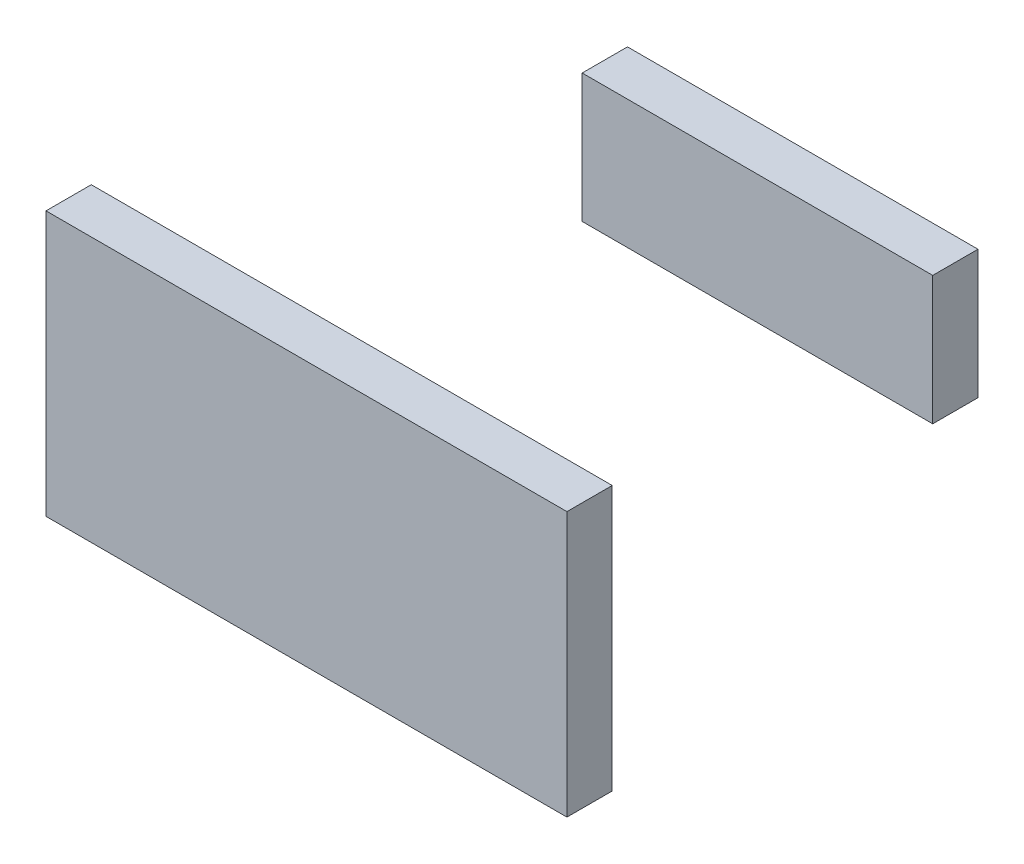
ISO-10303-21;
HEADER;
FILE_DESCRIPTION(('STEP AP214'),'2;1');
FILE_NAME('part.step','',(''),(''),'','','');
FILE_SCHEMA(('AUTOMOTIVE_DESIGN { 1 0 10303 214 1 1 1 1 }'));
ENDSEC;
DATA;
#1=APPLICATION_CONTEXT('core data for automotive mechanical design processes');
#2=APPLICATION_PROTOCOL_DEFINITION('international standard','automotive_design',2000,#1);
#3=PRODUCT_CONTEXT('',#1,'mechanical');
#4=PRODUCT('Part','Part','',(#3));
#5=PRODUCT_RELATED_PRODUCT_CATEGORY('part','',(#4));
#6=PRODUCT_DEFINITION_FORMATION('','',#4);
#7=PRODUCT_DEFINITION_CONTEXT('part definition',#1,'design');
#8=PRODUCT_DEFINITION('design','',#6,#7);
#9=PRODUCT_DEFINITION_SHAPE('','',#8);
#10=(LENGTH_UNIT() NAMED_UNIT(*) SI_UNIT(.MILLI.,.METRE.));
#11=(NAMED_UNIT(*) PLANE_ANGLE_UNIT() SI_UNIT($,.RADIAN.));
#12=(NAMED_UNIT(*) SI_UNIT($,.STERADIAN.) SOLID_ANGLE_UNIT());
#13=UNCERTAINTY_MEASURE_WITH_UNIT(LENGTH_MEASURE(1.E-05),#10,'distance_accuracy_value','');
#14=(GEOMETRIC_REPRESENTATION_CONTEXT(3) GLOBAL_UNCERTAINTY_ASSIGNED_CONTEXT((#13)) GLOBAL_UNIT_ASSIGNED_CONTEXT((#10,
#11,#12)) REPRESENTATION_CONTEXT('',''));
#15=CARTESIAN_POINT('',(0.,0.,0.));
#16=DIRECTION('',(0.,0.,1.));
#17=DIRECTION('',(1.,0.,0.));
#18=AXIS2_PLACEMENT_3D('',#15,#16,#17);
#19=CARTESIAN_POINT('',(-30.5127206325437,15.8128454974644,-40.));
#20=DIRECTION('',(1.,0.,0.));
#21=DIRECTION('',(0.,0.,-1.));
#22=AXIS2_PLACEMENT_3D('',#19,#20,#21);
#23=PLANE('',#22);
#24=DIRECTION('',(0.,-1.,0.));
#25=VECTOR('',#24,1.);
#26=CARTESIAN_POINT('',(-30.5127206325437,15.8128454974644,-50.));
#27=LINE('',#26,#25);
#28=CARTESIAN_POINT('',(-30.5127206325437,15.8128454974644,-50.));
#29=VERTEX_POINT('',#28);
#30=CARTESIAN_POINT('',(-30.5127206325437,-12.5885195711248,-50.));
#31=VERTEX_POINT('',#30);
#32=EDGE_CURVE('E112',#29,#31,#27,.T.);
#33=ORIENTED_EDGE('',*,*,#32,.T.);
#34=DIRECTION('',(0.,0.,-1.));
#35=VECTOR('',#34,1.);
#36=CARTESIAN_POINT('',(-30.5127206325437,-12.5885195711248,-40.));
#37=LINE('',#36,#35);
#38=CARTESIAN_POINT('',(-30.5127206325437,-12.5885195711248,-40.));
#39=VERTEX_POINT('',#38);
#40=EDGE_CURVE('E12',#39,#31,#37,.T.);
#41=ORIENTED_EDGE('',*,*,#40,.F.);
#42=DIRECTION('',(0.,-1.,0.));
#43=VECTOR('',#42,1.);
#44=CARTESIAN_POINT('',(-30.5127206325437,15.8128454974644,-40.));
#45=LINE('',#44,#43);
#46=CARTESIAN_POINT('',(-30.5127206325437,15.8128454974644,-40.));
#47=VERTEX_POINT('',#46);
#48=EDGE_CURVE('E100',#47,#39,#45,.T.);
#49=ORIENTED_EDGE('',*,*,#48,.F.);
#50=DIRECTION('',(0.,0.,-1.));
#51=VECTOR('',#50,1.);
#52=CARTESIAN_POINT('',(-30.5127206325437,15.8128454974644,-40.));
#53=LINE('',#52,#51);
#54=EDGE_CURVE('E108',#47,#29,#53,.T.);
#55=ORIENTED_EDGE('',*,*,#54,.T.);
#56=EDGE_LOOP('',(#33,#41,#49,#55));
#57=FACE_BOUND('',#56,.T.);
#58=ADVANCED_FACE('F49',(#57),#23,.F.);
#59=CARTESIAN_POINT('',(-30.5127206325437,-12.5885195711248,-40.));
#60=DIRECTION('',(0.,1.,0.));
#61=DIRECTION('',(0.,0.,1.));
#62=AXIS2_PLACEMENT_3D('',#59,#60,#61);
#63=PLANE('',#62);
#64=DIRECTION('',(1.,0.,0.));
#65=VECTOR('',#64,1.);
#66=CARTESIAN_POINT('',(-30.5127206325437,-12.5885195711248,-50.));
#67=LINE('',#66,#65);
#68=CARTESIAN_POINT('',(46.9096886760667,-12.5885195711248,-50.));
#69=VERTEX_POINT('',#68);
#70=EDGE_CURVE('E104',#31,#69,#67,.T.);
#71=ORIENTED_EDGE('',*,*,#70,.T.);
#72=DIRECTION('',(0.,0.,-1.));
#73=VECTOR('',#72,1.);
#74=CARTESIAN_POINT('',(46.9096886760667,-12.5885195711248,-40.));
#75=LINE('',#74,#73);
#76=CARTESIAN_POINT('',(46.9096886760667,-12.5885195711248,-40.));
#77=VERTEX_POINT('',#76);
#78=EDGE_CURVE('E57',#77,#69,#75,.T.);
#79=ORIENTED_EDGE('',*,*,#78,.F.);
#80=DIRECTION('',(1.,0.,0.));
#81=VECTOR('',#80,1.);
#82=CARTESIAN_POINT('',(-30.5127206325437,-12.5885195711248,-40.));
#83=LINE('',#82,#81);
#84=EDGE_CURVE('E95',#39,#77,#83,.T.);
#85=ORIENTED_EDGE('',*,*,#84,.F.);
#86=ORIENTED_EDGE('',*,*,#40,.T.);
#87=EDGE_LOOP('',(#71,#79,#85,#86));
#88=FACE_BOUND('',#87,.T.);
#89=ADVANCED_FACE('F103',(#88),#63,.F.);
#90=CARTESIAN_POINT('',(46.9096886760667,15.8128454974644,-40.));
#91=DIRECTION('',(-1.,0.,0.));
#92=DIRECTION('',(0.,0.,1.));
#93=AXIS2_PLACEMENT_3D('',#90,#91,#92);
#94=PLANE('',#93);
#95=DIRECTION('',(0.,1.,0.));
#96=VECTOR('',#95,1.);
#97=CARTESIAN_POINT('',(46.9096886760667,15.8128454974644,-50.));
#98=LINE('',#97,#96);
#99=CARTESIAN_POINT('',(46.9096886760667,15.8128454974644,-50.));
#100=VERTEX_POINT('',#99);
#101=EDGE_CURVE('E82',#69,#100,#98,.T.);
#102=ORIENTED_EDGE('',*,*,#101,.T.);
#103=DIRECTION('',(0.,0.,-1.));
#104=VECTOR('',#103,1.);
#105=CARTESIAN_POINT('',(46.9096886760667,15.8128454974644,-40.));
#106=LINE('',#105,#104);
#107=CARTESIAN_POINT('',(46.9096886760667,15.8128454974644,-40.));
#108=VERTEX_POINT('',#107);
#109=EDGE_CURVE('E105',#108,#100,#106,.T.);
#110=ORIENTED_EDGE('',*,*,#109,.F.);
#111=DIRECTION('',(0.,1.,0.));
#112=VECTOR('',#111,1.);
#113=CARTESIAN_POINT('',(46.9096886760667,15.8128454974644,-40.));
#114=LINE('',#113,#112);
#115=EDGE_CURVE('E98',#77,#108,#114,.T.);
#116=ORIENTED_EDGE('',*,*,#115,.F.);
#117=ORIENTED_EDGE('',*,*,#78,.T.);
#118=EDGE_LOOP('',(#102,#110,#116,#117));
#119=FACE_BOUND('',#118,.T.);
#120=ADVANCED_FACE('F106',(#119),#94,.F.);
#121=CARTESIAN_POINT('',(-30.5127206325437,15.8128454974644,-40.));
#122=DIRECTION('',(0.,-1.,0.));
#123=DIRECTION('',(0.,0.,-1.));
#124=AXIS2_PLACEMENT_3D('',#121,#122,#123);
#125=PLANE('',#124);
#126=DIRECTION('',(-1.,0.,0.));
#127=VECTOR('',#126,1.);
#128=CARTESIAN_POINT('',(-30.5127206325437,15.8128454974644,-50.));
#129=LINE('',#128,#127);
#130=EDGE_CURVE('E88',#100,#29,#129,.T.);
#131=ORIENTED_EDGE('',*,*,#130,.T.);
#132=ORIENTED_EDGE('',*,*,#54,.F.);
#133=DIRECTION('',(-1.,0.,0.));
#134=VECTOR('',#133,1.);
#135=CARTESIAN_POINT('',(-30.5127206325437,15.8128454974644,-40.));
#136=LINE('',#135,#134);
#137=EDGE_CURVE('E65',#108,#47,#136,.T.);
#138=ORIENTED_EDGE('',*,*,#137,.F.);
#139=ORIENTED_EDGE('',*,*,#109,.T.);
#140=EDGE_LOOP('',(#131,#132,#138,#139));
#141=FACE_BOUND('',#140,.T.);
#142=ADVANCED_FACE('F119',(#141),#125,.F.);
#143=CARTESIAN_POINT('',(0.,0.,-40.));
#144=DIRECTION('',(0.,0.,1.));
#145=DIRECTION('',(1.,0.,0.));
#146=AXIS2_PLACEMENT_3D('',#143,#144,#145);
#147=PLANE('',#146);
#148=ORIENTED_EDGE('',*,*,#48,.T.);
#149=ORIENTED_EDGE('',*,*,#84,.T.);
#150=ORIENTED_EDGE('',*,*,#115,.T.);
#151=ORIENTED_EDGE('',*,*,#137,.T.);
#152=EDGE_LOOP('',(#148,#149,#150,#151));
#153=FACE_BOUND('',#152,.T.);
#154=ADVANCED_FACE('F96',(#153),#147,.T.);
#155=CARTESIAN_POINT('',(0.,0.,-50.));
#156=DIRECTION('',(0.,0.,1.));
#157=DIRECTION('',(1.,0.,0.));
#158=AXIS2_PLACEMENT_3D('',#155,#156,#157);
#159=PLANE('',#158);
#160=ORIENTED_EDGE('',*,*,#32,.F.);
#161=ORIENTED_EDGE('',*,*,#130,.F.);
#162=ORIENTED_EDGE('',*,*,#101,.F.);
#163=ORIENTED_EDGE('',*,*,#70,.F.);
#164=EDGE_LOOP('',(#160,#161,#162,#163));
#165=FACE_BOUND('',#164,.T.);
#166=ADVANCED_FACE('F122',(#165),#159,.F.);
#167=CLOSED_SHELL('',(#58,#89,#120,#142,#154,#166));
#168=MANIFOLD_SOLID_BREP('B2',#167);
#169=CARTESIAN_POINT('',(-48.9475594742688,30.2269443768343,60.));
#170=DIRECTION('',(1.,0.,0.));
#171=DIRECTION('',(0.,0.,-1.));
#172=AXIS2_PLACEMENT_3D('',#169,#170,#171);
#173=PLANE('',#172);
#174=DIRECTION('',(0.,-1.,0.));
#175=VECTOR('',#174,1.);
#176=CARTESIAN_POINT('',(-48.9475594742688,30.2269443768343,50.));
#177=LINE('',#176,#175);
#178=CARTESIAN_POINT('',(-48.9475594742688,30.2269443768343,50.));
#179=VERTEX_POINT('',#178);
#180=CARTESIAN_POINT('',(-48.9475594742688,-28.217902756621,50.));
#181=VERTEX_POINT('',#180);
#182=EDGE_CURVE('E241',#179,#181,#177,.T.);
#183=ORIENTED_EDGE('',*,*,#182,.T.);
#184=DIRECTION('',(0.,0.,-1.));
#185=VECTOR('',#184,1.);
#186=CARTESIAN_POINT('',(-48.9475594742688,-28.217902756621,60.));
#187=LINE('',#186,#185);
#188=CARTESIAN_POINT('',(-48.9475594742688,-28.217902756621,60.));
#189=VERTEX_POINT('',#188);
#190=EDGE_CURVE('E47',#189,#181,#187,.T.);
#191=ORIENTED_EDGE('',*,*,#190,.F.);
#192=DIRECTION('',(0.,-1.,0.));
#193=VECTOR('',#192,1.);
#194=CARTESIAN_POINT('',(-48.9475594742688,30.2269443768343,60.));
#195=LINE('',#194,#193);
#196=CARTESIAN_POINT('',(-48.9475594742688,30.2269443768343,60.));
#197=VERTEX_POINT('',#196);
#198=EDGE_CURVE('E225',#197,#189,#195,.T.);
#199=ORIENTED_EDGE('',*,*,#198,.F.);
#200=DIRECTION('',(0.,0.,-1.));
#201=VECTOR('',#200,1.);
#202=CARTESIAN_POINT('',(-48.9475594742688,30.2269443768343,60.));
#203=LINE('',#202,#201);
#204=EDGE_CURVE('E237',#197,#179,#203,.T.);
#205=ORIENTED_EDGE('',*,*,#204,.T.);
#206=EDGE_LOOP('',(#183,#191,#199,#205));
#207=FACE_BOUND('',#206,.T.);
#208=ADVANCED_FACE('F173',(#207),#173,.F.);
#209=CARTESIAN_POINT('',(-48.9475594742688,-28.217902756621,60.));
#210=DIRECTION('',(0.,1.,0.));
#211=DIRECTION('',(0.,0.,1.));
#212=AXIS2_PLACEMENT_3D('',#209,#210,#211);
#213=PLANE('',#212);
#214=DIRECTION('',(1.,0.,0.));
#215=VECTOR('',#214,1.);
#216=CARTESIAN_POINT('',(-48.9475594742688,-28.217902756621,50.));
#217=LINE('',#216,#215);
#218=CARTESIAN_POINT('',(66.1157333197213,-28.217902756621,50.));
#219=VERTEX_POINT('',#218);
#220=EDGE_CURVE('E230',#181,#219,#217,.T.);
#221=ORIENTED_EDGE('',*,*,#220,.T.);
#222=DIRECTION('',(0.,0.,-1.));
#223=VECTOR('',#222,1.);
#224=CARTESIAN_POINT('',(66.1157333197213,-28.217902756621,60.));
#225=LINE('',#224,#223);
#226=CARTESIAN_POINT('',(66.1157333197213,-28.217902756621,60.));
#227=VERTEX_POINT('',#226);
#228=EDGE_CURVE('E182',#227,#219,#225,.T.);
#229=ORIENTED_EDGE('',*,*,#228,.F.);
#230=DIRECTION('',(1.,0.,0.));
#231=VECTOR('',#230,1.);
#232=CARTESIAN_POINT('',(-48.9475594742688,-28.217902756621,60.));
#233=LINE('',#232,#231);
#234=EDGE_CURVE('E220',#189,#227,#233,.T.);
#235=ORIENTED_EDGE('',*,*,#234,.F.);
#236=ORIENTED_EDGE('',*,*,#190,.T.);
#237=EDGE_LOOP('',(#221,#229,#235,#236));
#238=FACE_BOUND('',#237,.T.);
#239=ADVANCED_FACE('F229',(#238),#213,.F.);
#240=CARTESIAN_POINT('',(66.1157333197213,30.2269443768343,60.));
#241=DIRECTION('',(-1.,0.,0.));
#242=DIRECTION('',(0.,0.,1.));
#243=AXIS2_PLACEMENT_3D('',#240,#241,#242);
#244=PLANE('',#243);
#245=DIRECTION('',(0.,1.,0.));
#246=VECTOR('',#245,1.);
#247=CARTESIAN_POINT('',(66.1157333197213,30.2269443768343,50.));
#248=LINE('',#247,#246);
#249=CARTESIAN_POINT('',(66.1157333197213,30.2269443768343,50.));
#250=VERTEX_POINT('',#249);
#251=EDGE_CURVE('E207',#219,#250,#248,.T.);
#252=ORIENTED_EDGE('',*,*,#251,.T.);
#253=DIRECTION('',(0.,0.,-1.));
#254=VECTOR('',#253,1.);
#255=CARTESIAN_POINT('',(66.1157333197213,30.2269443768343,60.));
#256=LINE('',#255,#254);
#257=CARTESIAN_POINT('',(66.1157333197213,30.2269443768343,60.));
#258=VERTEX_POINT('',#257);
#259=EDGE_CURVE('E232',#258,#250,#256,.T.);
#260=ORIENTED_EDGE('',*,*,#259,.F.);
#261=DIRECTION('',(0.,1.,0.));
#262=VECTOR('',#261,1.);
#263=CARTESIAN_POINT('',(66.1157333197213,30.2269443768343,60.));
#264=LINE('',#263,#262);
#265=EDGE_CURVE('E223',#227,#258,#264,.T.);
#266=ORIENTED_EDGE('',*,*,#265,.F.);
#267=ORIENTED_EDGE('',*,*,#228,.T.);
#268=EDGE_LOOP('',(#252,#260,#266,#267));
#269=FACE_BOUND('',#268,.T.);
#270=ADVANCED_FACE('F233',(#269),#244,.F.);
#271=CARTESIAN_POINT('',(-48.9475594742688,30.2269443768343,60.));
#272=DIRECTION('',(0.,-1.,0.));
#273=DIRECTION('',(0.,0.,-1.));
#274=AXIS2_PLACEMENT_3D('',#271,#272,#273);
#275=PLANE('',#274);
#276=DIRECTION('',(-1.,0.,0.));
#277=VECTOR('',#276,1.);
#278=CARTESIAN_POINT('',(-48.9475594742688,30.2269443768343,50.));
#279=LINE('',#278,#277);
#280=EDGE_CURVE('E213',#250,#179,#279,.T.);
#281=ORIENTED_EDGE('',*,*,#280,.T.);
#282=ORIENTED_EDGE('',*,*,#204,.F.);
#283=DIRECTION('',(-1.,0.,0.));
#284=VECTOR('',#283,1.);
#285=CARTESIAN_POINT('',(-48.9475594742688,30.2269443768343,60.));
#286=LINE('',#285,#284);
#287=EDGE_CURVE('E190',#258,#197,#286,.T.);
#288=ORIENTED_EDGE('',*,*,#287,.F.);
#289=ORIENTED_EDGE('',*,*,#259,.T.);
#290=EDGE_LOOP('',(#281,#282,#288,#289));
#291=FACE_BOUND('',#290,.T.);
#292=ADVANCED_FACE('F254',(#291),#275,.F.);
#293=CARTESIAN_POINT('',(0.,0.,60.));
#294=DIRECTION('',(0.,0.,1.));
#295=DIRECTION('',(1.,0.,0.));
#296=AXIS2_PLACEMENT_3D('',#293,#294,#295);
#297=PLANE('',#296);
#298=ORIENTED_EDGE('',*,*,#198,.T.);
#299=ORIENTED_EDGE('',*,*,#234,.T.);
#300=ORIENTED_EDGE('',*,*,#265,.T.);
#301=ORIENTED_EDGE('',*,*,#287,.T.);
#302=EDGE_LOOP('',(#298,#299,#300,#301));
#303=FACE_BOUND('',#302,.T.);
#304=ADVANCED_FACE('F221',(#303),#297,.T.);
#305=CARTESIAN_POINT('',(0.,0.,50.));
#306=DIRECTION('',(0.,0.,1.));
#307=DIRECTION('',(1.,0.,0.));
#308=AXIS2_PLACEMENT_3D('',#305,#306,#307);
#309=PLANE('',#308);
#310=ORIENTED_EDGE('',*,*,#182,.F.);
#311=ORIENTED_EDGE('',*,*,#280,.F.);
#312=ORIENTED_EDGE('',*,*,#251,.F.);
#313=ORIENTED_EDGE('',*,*,#220,.F.);
#314=EDGE_LOOP('',(#310,#311,#312,#313));
#315=FACE_BOUND('',#314,.T.);
#316=ADVANCED_FACE('F257',(#315),#309,.F.);
#317=CLOSED_SHELL('',(#208,#239,#270,#292,#304,#316));
#318=MANIFOLD_SOLID_BREP('B6',#317);
#319=ADVANCED_BREP_SHAPE_REPRESENTATION('',(#18,#168,#318),#14);
#320=SHAPE_DEFINITION_REPRESENTATION(#9,#319);
ENDSEC;
END-ISO-10303-21;
